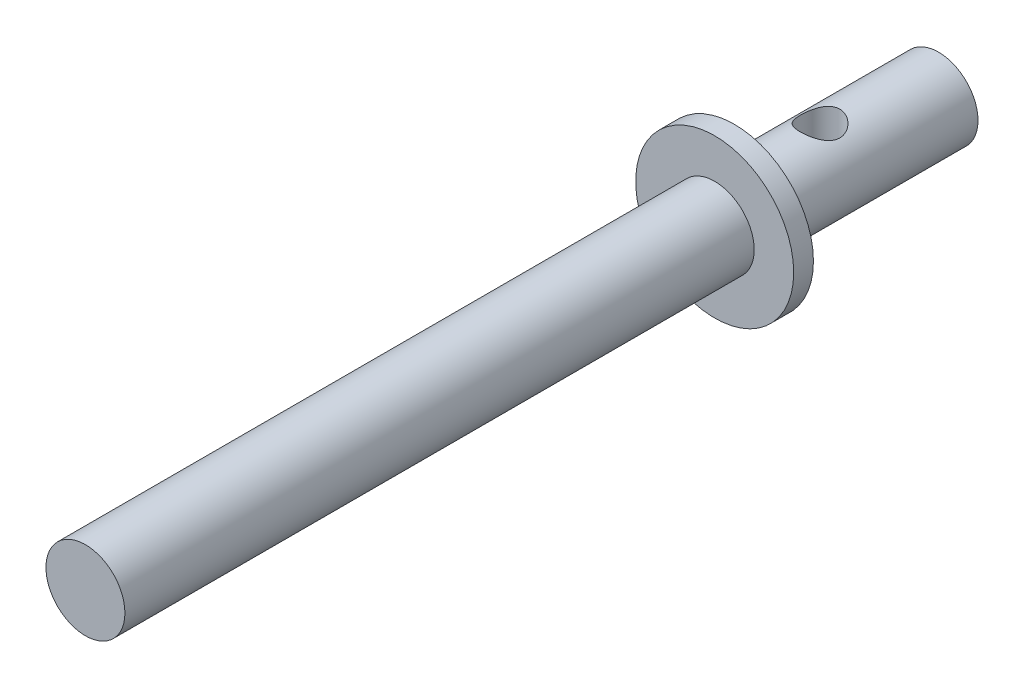
ISO-10303-21;
HEADER;
FILE_DESCRIPTION(('STEP AP214'),'2;1');
FILE_NAME('part.step','',(''),(''),'','','');
FILE_SCHEMA(('AUTOMOTIVE_DESIGN { 1 0 10303 214 1 1 1 1 }'));
ENDSEC;
DATA;
#1=APPLICATION_CONTEXT('core data for automotive mechanical design processes');
#2=APPLICATION_PROTOCOL_DEFINITION('international standard','automotive_design',2000,#1);
#3=PRODUCT_CONTEXT('',#1,'mechanical');
#4=PRODUCT('Part','Part','',(#3));
#5=PRODUCT_RELATED_PRODUCT_CATEGORY('part','',(#4));
#6=PRODUCT_DEFINITION_FORMATION('','',#4);
#7=PRODUCT_DEFINITION_CONTEXT('part definition',#1,'design');
#8=PRODUCT_DEFINITION('design','',#6,#7);
#9=PRODUCT_DEFINITION_SHAPE('','',#8);
#10=(LENGTH_UNIT() NAMED_UNIT(*) SI_UNIT(.MILLI.,.METRE.));
#11=(NAMED_UNIT(*) PLANE_ANGLE_UNIT() SI_UNIT($,.RADIAN.));
#12=(NAMED_UNIT(*) SI_UNIT($,.STERADIAN.) SOLID_ANGLE_UNIT());
#13=UNCERTAINTY_MEASURE_WITH_UNIT(LENGTH_MEASURE(1.E-05),#10,'distance_accuracy_value','');
#14=(GEOMETRIC_REPRESENTATION_CONTEXT(3) GLOBAL_UNCERTAINTY_ASSIGNED_CONTEXT((#13)) GLOBAL_UNIT_ASSIGNED_CONTEXT((#10,
#11,#12)) REPRESENTATION_CONTEXT('',''));
#15=CARTESIAN_POINT('',(0.,0.,0.));
#16=DIRECTION('',(0.,0.,1.));
#17=DIRECTION('',(1.,0.,0.));
#18=AXIS2_PLACEMENT_3D('',#15,#16,#17);
#19=CARTESIAN_POINT('',(0.,0.,64.8));
#20=DIRECTION('',(0.,0.,-1.));
#21=DIRECTION('',(-1.,0.,0.));
#22=AXIS2_PLACEMENT_3D('',#19,#20,#21);
#23=CYLINDRICAL_SURFACE('',#22,3.);
#24=CARTESIAN_POINT('',(0.,3.,7.5));
#25=CARTESIAN_POINT('',(0.0788579444268502,2.99999570107562,7.50000495347579));
#26=CARTESIAN_POINT('',(0.157809899546344,2.99685736529635,7.50625510968158));
#27=CARTESIAN_POINT('',(0.313380352903344,2.98461234055736,7.53097932051231));
#28=CARTESIAN_POINT('',(0.389994130070444,2.97549431743379,7.54947658949672));
#29=CARTESIAN_POINT('',(0.538400317320673,2.95224419105063,7.59779071292494));
#30=CARTESIAN_POINT('',(0.610210204408719,2.93813158766306,7.62756357637195));
#31=CARTESIAN_POINT('',(0.747708925209898,2.90618664773642,7.69735593204748));
#32=CARTESIAN_POINT('',(0.813398240985088,2.88835460450288,7.7373746163733));
#33=CARTESIAN_POINT('',(0.941261726642863,2.84934387387093,7.82927587422793));
#34=CARTESIAN_POINT('',(1.00298281668316,2.82802798691306,7.88172971885946));
#35=CARTESIAN_POINT('',(1.11716916730047,2.78489955370115,7.99578221887055));
#36=CARTESIAN_POINT('',(1.16962737466015,2.76308664313552,8.05738777765866));
#37=CARTESIAN_POINT('',(1.26787800067542,2.71948426796021,8.19372502428507));
#38=CARTESIAN_POINT('',(1.31283800332746,2.69782780455198,8.26910414751887));
#39=CARTESIAN_POINT('',(1.38925234033604,2.65928968158481,8.42755100397932));
#40=CARTESIAN_POINT('',(1.4207163224495,2.64240461410484,8.51061319308412));
#41=CARTESIAN_POINT('',(1.46719866328288,2.61686800556713,8.67699765813288));
#42=CARTESIAN_POINT('',(1.48308878562066,2.6077840737557,8.76000667810109));
#43=CARTESIAN_POINT('',(1.50064048996327,2.59772834922792,8.92796825666921));
#44=CARTESIAN_POINT('',(1.50231613255961,2.59674854014932,9.01291881130673));
#45=CARTESIAN_POINT('',(1.49203093075844,2.60266395385873,9.17142903647305));
#46=CARTESIAN_POINT('',(1.48167683930523,2.6086314549302,9.24513604683457));
#47=CARTESIAN_POINT('',(1.4504097735854,2.62614343100775,9.38958286405956));
#48=CARTESIAN_POINT('',(1.42949343584648,2.63768968247664,9.46032171795797));
#49=CARTESIAN_POINT('',(1.37731467057901,2.66531214619112,9.59884369884849));
#50=CARTESIAN_POINT('',(1.34582260067399,2.68148760995998,9.66651959817868));
#51=CARTESIAN_POINT('',(1.273562531502,2.71655106422106,9.79595143888501));
#52=CARTESIAN_POINT('',(1.2327903657187,2.73544027170286,9.85770470340013));
#53=CARTESIAN_POINT('',(1.13709908236918,2.77669736854929,9.98178187911484));
#54=CARTESIAN_POINT('',(1.08104168755392,2.79920265355119,10.0431853103642));
#55=CARTESIAN_POINT('',(0.95933336811206,2.84321434950611,10.1561031278864));
#56=CARTESIAN_POINT('',(0.893677884861428,2.86472027938201,10.2076127880508));
#57=CARTESIAN_POINT('',(0.750774758747773,2.90552980924446,10.3015284915446));
#58=CARTESIAN_POINT('',(0.673130387399113,2.92468476243011,10.3434007086686));
#59=CARTESIAN_POINT('',(0.510699323233194,2.95736821681863,10.4131455435645));
#60=CARTESIAN_POINT('',(0.425918364397913,2.9709011841533,10.4410292775227));
#61=CARTESIAN_POINT('',(0.259149737491052,2.98986500612153,10.479713105575));
#62=CARTESIAN_POINT('',(0.177512295822488,2.99587407451965,10.4917368536202));
#63=CARTESIAN_POINT('',(0.013169399924027,3.00109520188655,10.5021970967017));
#64=CARTESIAN_POINT('',(-0.0695355298048632,3.00031048081978,10.5006400284592));
#65=CARTESIAN_POINT('',(-0.22684945797898,2.99236788380152,10.4846899673719));
#66=CARTESIAN_POINT('',(-0.301589112074895,2.98570868532253,10.471301200905));
#67=CARTESIAN_POINT('',(-0.447610338452911,2.9673325697226,10.4336428921573));
#68=CARTESIAN_POINT('',(-0.51889152853663,2.95561509501618,10.4093721503198));
#69=CARTESIAN_POINT('',(-0.658332912674359,2.92776377120382,10.3500023003505));
#70=CARTESIAN_POINT('',(-0.726345595508705,2.91151322654446,10.3146134248256));
#71=CARTESIAN_POINT('',(-0.855692042548907,2.87615961476126,10.2343386965301));
#72=CARTESIAN_POINT('',(-0.917022944664887,2.85705533350407,10.1894487981069));
#73=CARTESIAN_POINT('',(-1.03765153393382,2.81562332004297,10.0863593620039));
#74=CARTESIAN_POINT('',(-1.09615811672854,2.79316327265249,10.0272856973323));
#75=CARTESIAN_POINT('',(-1.20278448167828,2.7489358741323,9.90011227308341));
#76=CARTESIAN_POINT('',(-1.25089707856781,2.72716901100071,9.83200632172812));
#77=CARTESIAN_POINT('',(-1.33756187171853,2.68576788309734,9.68453451874053));
#78=CARTESIAN_POINT('',(-1.37553824370037,2.66628794383591,9.60478310085828));
#79=CARTESIAN_POINT('',(-1.43712423890206,2.63361108441202,9.43873489863755));
#80=CARTESIAN_POINT('',(-1.46075237380052,2.62040607332625,9.35244671029966));
#81=CARTESIAN_POINT('',(-1.49079253120031,2.60342251538703,9.18463466567295));
#82=CARTESIAN_POINT('',(-1.49863949460818,2.59886075197597,9.10344861984714));
#83=CARTESIAN_POINT('',(-1.5010337315643,2.59748031962405,8.94082939925321));
#84=CARTESIAN_POINT('',(-1.49558676993486,2.60065829439585,8.85939634689321));
#85=CARTESIAN_POINT('',(-1.47288918838996,2.61356793076615,8.70677474769984));
#86=CARTESIAN_POINT('',(-1.45681247151455,2.62264641723988,8.63534929478289));
#87=CARTESIAN_POINT('',(-1.41476303733662,2.64556524281479,8.49628782086345));
#88=CARTESIAN_POINT('',(-1.38878713673988,2.65940711354503,8.42865302686195));
#89=CARTESIAN_POINT('',(-1.32572361795085,2.69142795546804,8.2940627235202));
#90=CARTESIAN_POINT('',(-1.28800670672355,2.70983583593881,8.22745814725646));
#91=CARTESIAN_POINT('',(-1.20322645745609,2.74852997452291,8.10108819572811));
#92=CARTESIAN_POINT('',(-1.15615825686234,2.76881720693416,8.04132640421833));
#93=CARTESIAN_POINT('',(-1.04730498999206,2.81193484737138,7.92278702646799));
#94=CARTESIAN_POINT('',(-0.984426634495893,2.83477474959942,7.86501134647456));
#95=CARTESIAN_POINT('',(-0.849232209349797,2.87816628389896,7.7606055248471));
#96=CARTESIAN_POINT('',(-0.776911084957796,2.89871667939293,7.71398139079514));
#97=CARTESIAN_POINT('',(-0.623897395174418,2.93547014349806,7.63314545593189));
#98=CARTESIAN_POINT('',(-0.543149255665096,2.95164144740899,7.5990237461453));
#99=CARTESIAN_POINT('',(-0.37611315170713,2.9775201194848,7.54528774836389));
#100=CARTESIAN_POINT('',(-0.28984169938365,2.98724585044602,7.52563222979143));
#101=CARTESIAN_POINT('',(-0.168902919736342,2.99543192870217,7.50915388337139));
#102=CARTESIAN_POINT('',(-0.135242819162347,2.99714048010376,7.50572603870049));
#103=CARTESIAN_POINT('',(-0.0677275977076368,2.99942545465223,7.50114800172887));
#104=CARTESIAN_POINT('',(-0.0338724714699424,3.00000184655071,7.49999787229469));
#105=CARTESIAN_POINT('',(0.,3.,7.5));
#106=B_SPLINE_CURVE_WITH_KNOTS('',3,(#24,#25,#26,#27,#28,#29,#30,#31,#32,#33,#34,#35,#36,#37,
#38,#39,#40,#41,#42,#43,#44,#45,#46,#47,#48,#49,#50,#51,#52,#53,#54,#55,#56,#57,#58,#59,#60,#61,
#62,#63,#64,#65,#66,#67,#68,#69,#70,#71,#72,#73,#74,#75,#76,#77,#78,#79,#80,#81,#82,#83,#84,#85,
#86,#87,#88,#89,#90,#91,#92,#93,#94,#95,#96,#97,#98,#99,#100,#101,#102,#103,#104,#105),
.UNSPECIFIED.,.T.,.F.,(4,2,2,2,2,2,2,2,2,2,2,2,2,2,2,2,2,2,2,2,2,2,2,2,2,2,2,2,2,2,2,2,2,2,2,2,
2,2,2,2,4),(0.,0.236436386130439,0.473322224563796,0.709293233238447,0.945245640872351,
1.19547263807713,1.44588935648105,1.71572589646129,1.98536921847421,2.23887018210344,
2.49212035993531,2.71508568613981,2.93812205888518,3.16635360252731,3.39468781890333,
3.65197412000818,3.90938301898029,4.17874533321661,4.44789325368419,4.69474935707018,
4.94148846767214,5.16910359759183,5.39674382446397,5.63089284041848,5.86514176122509,
6.12239415966628,6.37982382923148,6.64972023242588,6.91926767918176,7.1629396125457,
7.40650589797017,7.62686895373283,7.84730293182526,8.08254685170431,8.31791341715446,
8.58187864135757,8.84598575071869,9.1119602049529,9.37717362931724,9.47872920200875,
9.58028757766599),.UNSPECIFIED.);
#107=CARTESIAN_POINT('',(0.,3.,7.5));
#108=VERTEX_POINT('',#107);
#109=EDGE_CURVE('E37',#108,#108,#106,.T.);
#110=ORIENTED_EDGE('',*,*,#109,.T.);
#111=EDGE_LOOP('',(#110));
#112=FACE_BOUND('',#111,.T.);
#113=CARTESIAN_POINT('',(0.,-3.,7.5));
#114=CARTESIAN_POINT('',(-0.0788579444268502,-2.99999570107562,7.50000495347579));
#115=CARTESIAN_POINT('',(-0.157809899546344,-2.99685736529635,7.50625510968158));
#116=CARTESIAN_POINT('',(-0.313380352903344,-2.98461234055736,7.53097932051231));
#117=CARTESIAN_POINT('',(-0.389994130070444,-2.97549431743379,7.54947658949672));
#118=CARTESIAN_POINT('',(-0.538400317320673,-2.95224419105063,7.59779071292494));
#119=CARTESIAN_POINT('',(-0.610210204408719,-2.93813158766306,7.62756357637195));
#120=CARTESIAN_POINT('',(-0.747708925209898,-2.90618664773642,7.69735593204748));
#121=CARTESIAN_POINT('',(-0.813398240985088,-2.88835460450288,7.7373746163733));
#122=CARTESIAN_POINT('',(-0.941261726642863,-2.84934387387093,7.82927587422793));
#123=CARTESIAN_POINT('',(-1.00298281668316,-2.82802798691306,7.88172971885946));
#124=CARTESIAN_POINT('',(-1.11716916730047,-2.78489955370115,7.99578221887055));
#125=CARTESIAN_POINT('',(-1.16962737466015,-2.76308664313552,8.05738777765866));
#126=CARTESIAN_POINT('',(-1.26787800067542,-2.71948426796021,8.19372502428507));
#127=CARTESIAN_POINT('',(-1.31283800332746,-2.69782780455198,8.26910414751887));
#128=CARTESIAN_POINT('',(-1.38925234033604,-2.65928968158481,8.42755100397932));
#129=CARTESIAN_POINT('',(-1.4207163224495,-2.64240461410484,8.51061319308412));
#130=CARTESIAN_POINT('',(-1.46719866328288,-2.61686800556713,8.67699765813288));
#131=CARTESIAN_POINT('',(-1.48308878562066,-2.6077840737557,8.76000667810109));
#132=CARTESIAN_POINT('',(-1.50064048996327,-2.59772834922792,8.92796825666921));
#133=CARTESIAN_POINT('',(-1.50231613255961,-2.59674854014932,9.01291881130673));
#134=CARTESIAN_POINT('',(-1.49203093075844,-2.60266395385873,9.17142903647305));
#135=CARTESIAN_POINT('',(-1.48167683930523,-2.6086314549302,9.24513604683457));
#136=CARTESIAN_POINT('',(-1.4504097735854,-2.62614343100775,9.38958286405956));
#137=CARTESIAN_POINT('',(-1.42949343584648,-2.63768968247664,9.46032171795797));
#138=CARTESIAN_POINT('',(-1.37731467057901,-2.66531214619112,9.59884369884849));
#139=CARTESIAN_POINT('',(-1.34582260067399,-2.68148760995998,9.66651959817868));
#140=CARTESIAN_POINT('',(-1.273562531502,-2.71655106422106,9.79595143888501));
#141=CARTESIAN_POINT('',(-1.2327903657187,-2.73544027170286,9.85770470340013));
#142=CARTESIAN_POINT('',(-1.13709908236918,-2.77669736854929,9.98178187911484));
#143=CARTESIAN_POINT('',(-1.08104168755392,-2.79920265355119,10.0431853103642));
#144=CARTESIAN_POINT('',(-0.95933336811206,-2.84321434950611,10.1561031278864));
#145=CARTESIAN_POINT('',(-0.893677884861428,-2.86472027938201,10.2076127880508));
#146=CARTESIAN_POINT('',(-0.750774758747773,-2.90552980924446,10.3015284915446));
#147=CARTESIAN_POINT('',(-0.673130387399113,-2.92468476243011,10.3434007086686));
#148=CARTESIAN_POINT('',(-0.510699323233194,-2.95736821681863,10.4131455435645));
#149=CARTESIAN_POINT('',(-0.425918364397913,-2.9709011841533,10.4410292775227));
#150=CARTESIAN_POINT('',(-0.259149737491052,-2.98986500612153,10.479713105575));
#151=CARTESIAN_POINT('',(-0.177512295822488,-2.99587407451965,10.4917368536202));
#152=CARTESIAN_POINT('',(-0.013169399924027,-3.00109520188655,10.5021970967017));
#153=CARTESIAN_POINT('',(0.0695355298048632,-3.00031048081978,10.5006400284592));
#154=CARTESIAN_POINT('',(0.22684945797898,-2.99236788380152,10.4846899673719));
#155=CARTESIAN_POINT('',(0.301589112074895,-2.98570868532253,10.471301200905));
#156=CARTESIAN_POINT('',(0.447610338452911,-2.9673325697226,10.4336428921573));
#157=CARTESIAN_POINT('',(0.51889152853663,-2.95561509501618,10.4093721503198));
#158=CARTESIAN_POINT('',(0.658332912674359,-2.92776377120382,10.3500023003505));
#159=CARTESIAN_POINT('',(0.726345595508705,-2.91151322654446,10.3146134248256));
#160=CARTESIAN_POINT('',(0.855692042548907,-2.87615961476126,10.2343386965301));
#161=CARTESIAN_POINT('',(0.917022944664887,-2.85705533350407,10.1894487981069));
#162=CARTESIAN_POINT('',(1.03765153393382,-2.81562332004297,10.0863593620039));
#163=CARTESIAN_POINT('',(1.09615811672854,-2.79316327265249,10.0272856973323));
#164=CARTESIAN_POINT('',(1.20278448167828,-2.7489358741323,9.90011227308341));
#165=CARTESIAN_POINT('',(1.25089707856781,-2.72716901100071,9.83200632172812));
#166=CARTESIAN_POINT('',(1.33756187171853,-2.68576788309734,9.68453451874053));
#167=CARTESIAN_POINT('',(1.37553824370037,-2.66628794383591,9.60478310085828));
#168=CARTESIAN_POINT('',(1.43712423890206,-2.63361108441202,9.43873489863755));
#169=CARTESIAN_POINT('',(1.46075237380052,-2.62040607332625,9.35244671029966));
#170=CARTESIAN_POINT('',(1.49079253120031,-2.60342251538703,9.18463466567295));
#171=CARTESIAN_POINT('',(1.49863949460818,-2.59886075197597,9.10344861984714));
#172=CARTESIAN_POINT('',(1.5010337315643,-2.59748031962405,8.94082939925321));
#173=CARTESIAN_POINT('',(1.49558676993486,-2.60065829439585,8.85939634689321));
#174=CARTESIAN_POINT('',(1.47288918838996,-2.61356793076615,8.70677474769984));
#175=CARTESIAN_POINT('',(1.45681247151455,-2.62264641723988,8.63534929478289));
#176=CARTESIAN_POINT('',(1.41476303733662,-2.64556524281479,8.49628782086345));
#177=CARTESIAN_POINT('',(1.38878713673988,-2.65940711354503,8.42865302686195));
#178=CARTESIAN_POINT('',(1.32572361795085,-2.69142795546804,8.2940627235202));
#179=CARTESIAN_POINT('',(1.28800670672355,-2.70983583593881,8.22745814725646));
#180=CARTESIAN_POINT('',(1.20322645745609,-2.74852997452291,8.10108819572811));
#181=CARTESIAN_POINT('',(1.15615825686234,-2.76881720693416,8.04132640421833));
#182=CARTESIAN_POINT('',(1.04730498999206,-2.81193484737138,7.92278702646799));
#183=CARTESIAN_POINT('',(0.984426634495893,-2.83477474959942,7.86501134647456));
#184=CARTESIAN_POINT('',(0.849232209349797,-2.87816628389896,7.7606055248471));
#185=CARTESIAN_POINT('',(0.776911084957796,-2.89871667939293,7.71398139079514));
#186=CARTESIAN_POINT('',(0.623897395174418,-2.93547014349806,7.63314545593189));
#187=CARTESIAN_POINT('',(0.543149255665096,-2.95164144740899,7.5990237461453));
#188=CARTESIAN_POINT('',(0.37611315170713,-2.9775201194848,7.54528774836389));
#189=CARTESIAN_POINT('',(0.28984169938365,-2.98724585044602,7.52563222979143));
#190=CARTESIAN_POINT('',(0.168902919736342,-2.99543192870217,7.50915388337139));
#191=CARTESIAN_POINT('',(0.135242819162347,-2.99714048010376,7.50572603870049));
#192=CARTESIAN_POINT('',(0.0677275977076368,-2.99942545465223,7.50114800172887));
#193=CARTESIAN_POINT('',(0.0338724714699424,-3.00000184655071,7.49999787229469));
#194=CARTESIAN_POINT('',(0.,-3.,7.5));
#195=B_SPLINE_CURVE_WITH_KNOTS('',3,(#113,#114,#115,#116,#117,#118,#119,#120,#121,#122,#123,
#124,#125,#126,#127,#128,#129,#130,#131,#132,#133,#134,#135,#136,#137,#138,#139,#140,#141,#142,
#143,#144,#145,#146,#147,#148,#149,#150,#151,#152,#153,#154,#155,#156,#157,#158,#159,#160,#161,
#162,#163,#164,#165,#166,#167,#168,#169,#170,#171,#172,#173,#174,#175,#176,#177,#178,#179,#180,
#181,#182,#183,#184,#185,#186,#187,#188,#189,#190,#191,#192,#193,#194),.UNSPECIFIED.,.T.,.F.,(4,
2,2,2,2,2,2,2,2,2,2,2,2,2,2,2,2,2,2,2,2,2,2,2,2,2,2,2,2,2,2,2,2,2,2,2,2,2,2,2,4),(0.,
0.236436386130439,0.473322224563796,0.709293233238447,0.945245640872351,1.19547263807713,
1.44588935648105,1.71572589646129,1.98536921847421,2.23887018210344,2.49212035993531,
2.71508568613981,2.93812205888518,3.16635360252731,3.39468781890333,3.65197412000818,
3.90938301898029,4.17874533321661,4.44789325368419,4.69474935707018,4.94148846767214,
5.16910359759183,5.39674382446397,5.63089284041848,5.86514176122509,6.12239415966628,
6.37982382923148,6.64972023242588,6.91926767918176,7.1629396125457,7.40650589797017,
7.62686895373283,7.84730293182526,8.08254685170431,8.31791341715446,8.58187864135757,
8.84598575071869,9.1119602049529,9.37717362931724,9.47872920200875,9.58028757766599),.UNSPECIFIED.);
#196=CARTESIAN_POINT('',(0.,-3.,7.5));
#197=VERTEX_POINT('',#196);
#198=EDGE_CURVE('E54',#197,#197,#195,.T.);
#199=ORIENTED_EDGE('',*,*,#198,.T.);
#200=EDGE_LOOP('',(#199));
#201=FACE_BOUND('',#200,.T.);
#202=CARTESIAN_POINT('',(0.,0.,0.));
#203=DIRECTION('',(0.,0.,1.));
#204=DIRECTION('',(1.,0.,0.));
#205=AXIS2_PLACEMENT_3D('',#202,#203,#204);
#206=CIRCLE('',#205,3.);
#207=CARTESIAN_POINT('',(3.,0.,0.));
#208=VERTEX_POINT('',#207);
#209=EDGE_CURVE('E49',#208,#208,#206,.T.);
#210=ORIENTED_EDGE('',*,*,#209,.T.);
#211=EDGE_LOOP('',(#210));
#212=FACE_BOUND('',#211,.T.);
#213=CARTESIAN_POINT('',(0.,0.,15.5));
#214=DIRECTION('',(0.,0.,1.));
#215=DIRECTION('',(1.,0.,0.));
#216=AXIS2_PLACEMENT_3D('',#213,#214,#215);
#217=CIRCLE('',#216,3.);
#218=CARTESIAN_POINT('',(3.,0.,15.5));
#219=VERTEX_POINT('',#218);
#220=EDGE_CURVE('E10',#219,#219,#217,.T.);
#221=ORIENTED_EDGE('',*,*,#220,.F.);
#222=EDGE_LOOP('',(#221));
#223=FACE_BOUND('',#222,.T.);
#224=ADVANCED_FACE('F32',(#112,#201,#212,#223),#23,.T.);
#225=CARTESIAN_POINT('',(0.,0.,0.));
#226=DIRECTION('',(0.,0.,1.));
#227=DIRECTION('',(1.,0.,0.));
#228=AXIS2_PLACEMENT_3D('',#225,#226,#227);
#229=PLANE('',#228);
#230=ORIENTED_EDGE('',*,*,#209,.F.);
#231=EDGE_LOOP('',(#230));
#232=FACE_BOUND('',#231,.T.);
#233=ADVANCED_FACE('F75',(#232),#229,.F.);
#234=CARTESIAN_POINT('',(0.,0.,15.5));
#235=DIRECTION('',(0.,0.,1.));
#236=DIRECTION('',(1.,0.,0.));
#237=AXIS2_PLACEMENT_3D('',#234,#235,#236);
#238=CYLINDRICAL_SURFACE('',#237,6.);
#239=CARTESIAN_POINT('',(0.,0.,15.5));
#240=DIRECTION('',(0.,0.,1.));
#241=DIRECTION('',(1.,0.,0.));
#242=AXIS2_PLACEMENT_3D('',#239,#240,#241);
#243=CIRCLE('',#242,6.);
#244=CARTESIAN_POINT('',(6.,0.,15.5));
#245=VERTEX_POINT('',#244);
#246=EDGE_CURVE('E89',#245,#245,#243,.T.);
#247=ORIENTED_EDGE('',*,*,#246,.T.);
#248=EDGE_LOOP('',(#247));
#249=FACE_BOUND('',#248,.T.);
#250=CARTESIAN_POINT('',(0.,0.,17.));
#251=DIRECTION('',(0.,0.,1.));
#252=DIRECTION('',(1.,0.,0.));
#253=AXIS2_PLACEMENT_3D('',#250,#251,#252);
#254=CIRCLE('',#253,6.);
#255=CARTESIAN_POINT('',(6.,0.,17.));
#256=VERTEX_POINT('',#255);
#257=EDGE_CURVE('E91',#256,#256,#254,.T.);
#258=ORIENTED_EDGE('',*,*,#257,.F.);
#259=EDGE_LOOP('',(#258));
#260=FACE_BOUND('',#259,.T.);
#261=ADVANCED_FACE('F68',(#249,#260),#238,.T.);
#262=CARTESIAN_POINT('',(0.,0.,15.5));
#263=DIRECTION('',(0.,0.,1.));
#264=DIRECTION('',(1.,0.,0.));
#265=AXIS2_PLACEMENT_3D('',#262,#263,#264);
#266=PLANE('',#265);
#267=ORIENTED_EDGE('',*,*,#220,.T.);
#268=EDGE_LOOP('',(#267));
#269=FACE_BOUND('',#268,.T.);
#270=ORIENTED_EDGE('',*,*,#246,.F.);
#271=EDGE_LOOP('',(#270));
#272=FACE_BOUND('',#271,.T.);
#273=ADVANCED_FACE('F63',(#269,#272),#266,.F.);
#274=CARTESIAN_POINT('',(0.,0.,17.));
#275=DIRECTION('',(0.,0.,1.));
#276=DIRECTION('',(1.,0.,0.));
#277=AXIS2_PLACEMENT_3D('',#274,#275,#276);
#278=PLANE('',#277);
#279=CARTESIAN_POINT('',(0.,0.,17.));
#280=DIRECTION('',(0.,0.,1.));
#281=DIRECTION('',(1.,0.,0.));
#282=AXIS2_PLACEMENT_3D('',#279,#280,#281);
#283=CIRCLE('',#282,3.);
#284=CARTESIAN_POINT('',(3.,0.,17.));
#285=VERTEX_POINT('',#284);
#286=EDGE_CURVE('E52',#285,#285,#283,.T.);
#287=ORIENTED_EDGE('',*,*,#286,.F.);
#288=EDGE_LOOP('',(#287));
#289=FACE_BOUND('',#288,.T.);
#290=ORIENTED_EDGE('',*,*,#257,.T.);
#291=EDGE_LOOP('',(#290));
#292=FACE_BOUND('',#291,.T.);
#293=ADVANCED_FACE('F67',(#289,#292),#278,.T.);
#294=CARTESIAN_POINT('',(0.,0.,64.8));
#295=DIRECTION('',(0.,0.,1.));
#296=DIRECTION('',(1.,0.,0.));
#297=AXIS2_PLACEMENT_3D('',#294,#295,#296);
#298=PLANE('',#297);
#299=CARTESIAN_POINT('',(0.,0.,64.8));
#300=DIRECTION('',(0.,0.,1.));
#301=DIRECTION('',(1.,0.,0.));
#302=AXIS2_PLACEMENT_3D('',#299,#300,#301);
#303=CIRCLE('',#302,3.);
#304=CARTESIAN_POINT('',(3.,0.,64.8));
#305=VERTEX_POINT('',#304);
#306=EDGE_CURVE('E44',#305,#305,#303,.T.);
#307=ORIENTED_EDGE('',*,*,#306,.T.);
#308=EDGE_LOOP('',(#307));
#309=FACE_BOUND('',#308,.T.);
#310=ADVANCED_FACE('F71',(#309),#298,.T.);
#311=ORIENTED_EDGE('',*,*,#286,.T.);
#312=EDGE_LOOP('',(#311));
#313=FACE_BOUND('',#312,.T.);
#314=ORIENTED_EDGE('',*,*,#306,.F.);
#315=EDGE_LOOP('',(#314));
#316=FACE_BOUND('',#315,.T.);
#317=ADVANCED_FACE('F34',(#313,#316),#23,.T.);
#318=CARTESIAN_POINT('',(0.,3.67011605523015,9.));
#319=DIRECTION('',(0.,-1.,0.));
#320=DIRECTION('',(0.,0.,-1.));
#321=AXIS2_PLACEMENT_3D('',#318,#319,#320);
#322=CYLINDRICAL_SURFACE('',#321,1.5);
#323=ORIENTED_EDGE('',*,*,#198,.F.);
#324=EDGE_LOOP('',(#323));
#325=FACE_BOUND('',#324,.T.);
#326=ORIENTED_EDGE('',*,*,#109,.F.);
#327=EDGE_LOOP('',(#326));
#328=FACE_BOUND('',#327,.T.);
#329=ADVANCED_FACE('F58',(#325,#328),#322,.F.);
#330=CLOSED_SHELL('',(#224,#233,#261,#273,#293,#310,#317,#329));
#331=MANIFOLD_SOLID_BREP('B2',#330);
#332=ADVANCED_BREP_SHAPE_REPRESENTATION('',(#18,#331),#14);
#333=SHAPE_DEFINITION_REPRESENTATION(#9,#332);
ENDSEC;
END-ISO-10303-21;
